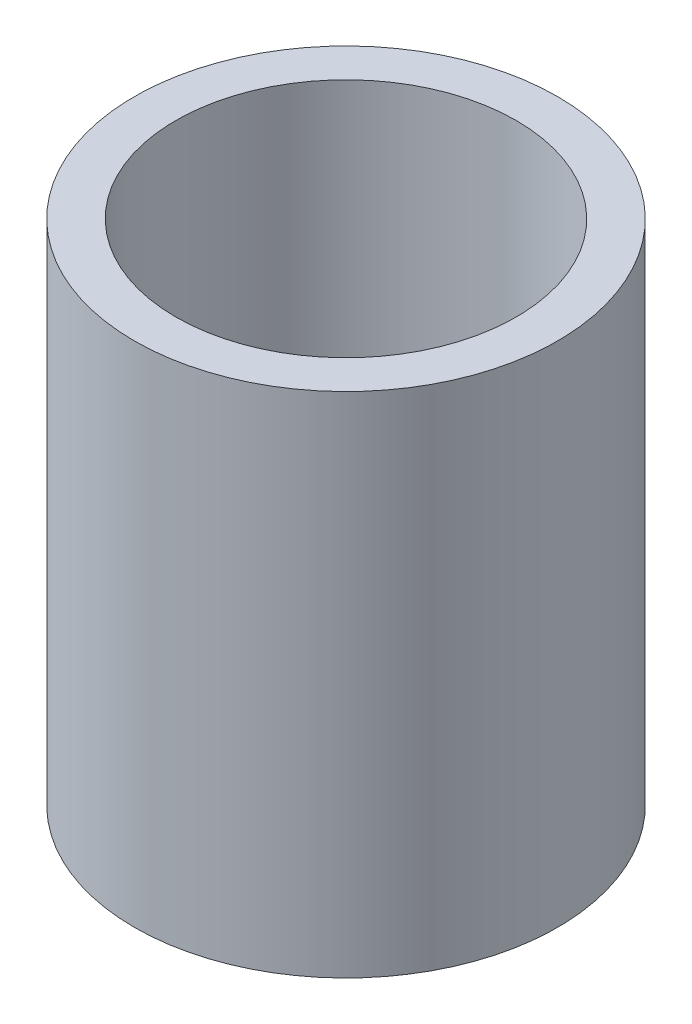
ISO-10303-21;
HEADER;
FILE_DESCRIPTION(('STEP AP214'),'2;1');
FILE_NAME('part.step','',(''),(''),'','','');
FILE_SCHEMA(('AUTOMOTIVE_DESIGN { 1 0 10303 214 1 1 1 1 }'));
ENDSEC;
DATA;
#1=APPLICATION_CONTEXT('core data for automotive mechanical design processes');
#2=APPLICATION_PROTOCOL_DEFINITION('international standard','automotive_design',2000,#1);
#3=PRODUCT_CONTEXT('',#1,'mechanical');
#4=PRODUCT('Part','Part','',(#3));
#5=PRODUCT_RELATED_PRODUCT_CATEGORY('part','',(#4));
#6=PRODUCT_DEFINITION_FORMATION('','',#4);
#7=PRODUCT_DEFINITION_CONTEXT('part definition',#1,'design');
#8=PRODUCT_DEFINITION('design','',#6,#7);
#9=PRODUCT_DEFINITION_SHAPE('','',#8);
#10=(LENGTH_UNIT() NAMED_UNIT(*) SI_UNIT(.MILLI.,.METRE.));
#11=(NAMED_UNIT(*) PLANE_ANGLE_UNIT() SI_UNIT($,.RADIAN.));
#12=(NAMED_UNIT(*) SI_UNIT($,.STERADIAN.) SOLID_ANGLE_UNIT());
#13=UNCERTAINTY_MEASURE_WITH_UNIT(LENGTH_MEASURE(1.E-05),#10,'distance_accuracy_value','');
#14=(GEOMETRIC_REPRESENTATION_CONTEXT(3) GLOBAL_UNCERTAINTY_ASSIGNED_CONTEXT((#13)) GLOBAL_UNIT_ASSIGNED_CONTEXT((#10,
#11,#12)) REPRESENTATION_CONTEXT('',''));
#15=CARTESIAN_POINT('',(0.,0.,0.));
#16=DIRECTION('',(0.,0.,1.));
#17=DIRECTION('',(1.,0.,0.));
#18=AXIS2_PLACEMENT_3D('',#15,#16,#17);
#19=CARTESIAN_POINT('',(0.,38.1,0.));
#20=DIRECTION('',(0.,1.,0.));
#21=DIRECTION('',(0.,0.,1.));
#22=AXIS2_PLACEMENT_3D('',#19,#20,#21);
#23=PLANE('',#22);
#24=CARTESIAN_POINT('',(0.,38.1,0.));
#25=DIRECTION('',(0.,1.,0.));
#26=DIRECTION('',(0.,0.,1.));
#27=AXIS2_PLACEMENT_3D('',#24,#25,#26);
#28=CIRCLE('',#27,15.875);
#29=CARTESIAN_POINT('',(0.,38.1,-15.875));
#30=VERTEX_POINT('',#29);
#31=EDGE_CURVE('E10',#30,#30,#28,.T.);
#32=ORIENTED_EDGE('',*,*,#31,.T.);
#33=EDGE_LOOP('',(#32));
#34=FACE_BOUND('',#33,.T.);
#35=CARTESIAN_POINT('',(0.,38.1,0.));
#36=DIRECTION('',(0.,1.,0.));
#37=DIRECTION('',(0.,0.,1.));
#38=AXIS2_PLACEMENT_3D('',#35,#36,#37);
#39=CIRCLE('',#38,12.76985);
#40=CARTESIAN_POINT('',(0.,38.1,-12.76985));
#41=VERTEX_POINT('',#40);
#42=EDGE_CURVE('E41',#41,#41,#39,.T.);
#43=ORIENTED_EDGE('',*,*,#42,.F.);
#44=EDGE_LOOP('',(#43));
#45=FACE_BOUND('',#44,.T.);
#46=ADVANCED_FACE('F30',(#34,#45),#23,.T.);
#47=CARTESIAN_POINT('',(0.,0.,0.));
#48=DIRECTION('',(0.,1.,0.));
#49=DIRECTION('',(0.,0.,1.));
#50=AXIS2_PLACEMENT_3D('',#47,#48,#49);
#51=PLANE('',#50);
#52=CARTESIAN_POINT('',(0.,0.,0.));
#53=DIRECTION('',(0.,1.,0.));
#54=DIRECTION('',(0.,0.,1.));
#55=AXIS2_PLACEMENT_3D('',#52,#53,#54);
#56=CIRCLE('',#55,15.875);
#57=CARTESIAN_POINT('',(0.,0.,-15.875));
#58=VERTEX_POINT('',#57);
#59=EDGE_CURVE('E34',#58,#58,#56,.T.);
#60=ORIENTED_EDGE('',*,*,#59,.F.);
#61=EDGE_LOOP('',(#60));
#62=FACE_BOUND('',#61,.T.);
#63=CARTESIAN_POINT('',(0.,0.,0.));
#64=DIRECTION('',(0.,1.,0.));
#65=DIRECTION('',(0.,0.,1.));
#66=AXIS2_PLACEMENT_3D('',#63,#64,#65);
#67=CIRCLE('',#66,12.76985);
#68=CARTESIAN_POINT('',(0.,0.,-12.76985));
#69=VERTEX_POINT('',#68);
#70=EDGE_CURVE('E43',#69,#69,#67,.T.);
#71=ORIENTED_EDGE('',*,*,#70,.T.);
#72=EDGE_LOOP('',(#71));
#73=FACE_BOUND('',#72,.T.);
#74=ADVANCED_FACE('F53',(#62,#73),#51,.F.);
#75=CARTESIAN_POINT('',(0.,38.1,0.));
#76=DIRECTION('',(0.,-1.,0.));
#77=DIRECTION('',(0.,0.,-1.));
#78=AXIS2_PLACEMENT_3D('',#75,#76,#77);
#79=CYLINDRICAL_SURFACE('',#78,15.875);
#80=CARTESIAN_POINT('',(0.,38.1,-15.875));
#81=CARTESIAN_POINT('',(0.,37.703125,-15.875));
#82=CARTESIAN_POINT('',(0.,37.30625,-15.875));
#83=CARTESIAN_POINT('',(0.,36.5125,-15.875));
#84=CARTESIAN_POINT('',(0.,36.115625,-15.875));
#85=CARTESIAN_POINT('',(0.,35.321875,-15.875));
#86=CARTESIAN_POINT('',(0.,34.925,-15.875));
#87=CARTESIAN_POINT('',(0.,34.13125,-15.875));
#88=CARTESIAN_POINT('',(0.,33.734375,-15.875));
#89=CARTESIAN_POINT('',(0.,32.940625,-15.875));
#90=CARTESIAN_POINT('',(0.,32.54375,-15.875));
#91=CARTESIAN_POINT('',(0.,31.75,-15.875));
#92=CARTESIAN_POINT('',(0.,31.353125,-15.875));
#93=CARTESIAN_POINT('',(0.,30.559375,-15.875));
#94=CARTESIAN_POINT('',(0.,30.1625,-15.875));
#95=CARTESIAN_POINT('',(0.,29.36875,-15.875));
#96=CARTESIAN_POINT('',(0.,28.971875,-15.875));
#97=CARTESIAN_POINT('',(0.,28.178125,-15.875));
#98=CARTESIAN_POINT('',(0.,27.78125,-15.875));
#99=CARTESIAN_POINT('',(0.,26.9875,-15.875));
#100=CARTESIAN_POINT('',(0.,26.590625,-15.875));
#101=CARTESIAN_POINT('',(0.,25.796875,-15.875));
#102=CARTESIAN_POINT('',(0.,25.4,-15.875));
#103=CARTESIAN_POINT('',(0.,24.60625,-15.875));
#104=CARTESIAN_POINT('',(0.,24.209375,-15.875));
#105=CARTESIAN_POINT('',(0.,23.415625,-15.875));
#106=CARTESIAN_POINT('',(0.,23.01875,-15.875));
#107=CARTESIAN_POINT('',(0.,22.225,-15.875));
#108=CARTESIAN_POINT('',(0.,21.828125,-15.875));
#109=CARTESIAN_POINT('',(0.,21.034375,-15.875));
#110=CARTESIAN_POINT('',(0.,20.6375,-15.875));
#111=CARTESIAN_POINT('',(0.,19.84375,-15.875));
#112=CARTESIAN_POINT('',(0.,19.446875,-15.875));
#113=CARTESIAN_POINT('',(0.,18.653125,-15.875));
#114=CARTESIAN_POINT('',(0.,18.25625,-15.875));
#115=CARTESIAN_POINT('',(0.,17.4625,-15.875));
#116=CARTESIAN_POINT('',(0.,17.065625,-15.875));
#117=CARTESIAN_POINT('',(0.,16.271875,-15.875));
#118=CARTESIAN_POINT('',(0.,15.875,-15.875));
#119=CARTESIAN_POINT('',(0.,15.08125,-15.875));
#120=CARTESIAN_POINT('',(0.,14.684375,-15.875));
#121=CARTESIAN_POINT('',(0.,13.890625,-15.875));
#122=CARTESIAN_POINT('',(0.,13.49375,-15.875));
#123=CARTESIAN_POINT('',(0.,12.7,-15.875));
#124=CARTESIAN_POINT('',(0.,12.303125,-15.875));
#125=CARTESIAN_POINT('',(0.,11.509375,-15.875));
#126=CARTESIAN_POINT('',(0.,11.1125,-15.875));
#127=CARTESIAN_POINT('',(0.,10.31875,-15.875));
#128=CARTESIAN_POINT('',(0.,9.921875,-15.875));
#129=CARTESIAN_POINT('',(0.,9.128125,-15.875));
#130=CARTESIAN_POINT('',(0.,8.73125,-15.875));
#131=CARTESIAN_POINT('',(0.,7.9375,-15.875));
#132=CARTESIAN_POINT('',(0.,7.540625,-15.875));
#133=CARTESIAN_POINT('',(0.,6.746875,-15.875));
#134=CARTESIAN_POINT('',(0.,6.35,-15.875));
#135=CARTESIAN_POINT('',(0.,5.55625,-15.875));
#136=CARTESIAN_POINT('',(0.,5.159375,-15.875));
#137=CARTESIAN_POINT('',(0.,4.365625,-15.875));
#138=CARTESIAN_POINT('',(0.,3.96875,-15.875));
#139=CARTESIAN_POINT('',(0.,3.175,-15.875));
#140=CARTESIAN_POINT('',(0.,2.778125,-15.875));
#141=CARTESIAN_POINT('',(0.,1.984375,-15.875));
#142=CARTESIAN_POINT('',(0.,1.5875,-15.875));
#143=CARTESIAN_POINT('',(0.,0.79375,-15.875));
#144=CARTESIAN_POINT('',(0.,0.396875,-15.875));
#145=CARTESIAN_POINT('',(0.,0.,-15.875));
#146=B_SPLINE_CURVE_WITH_KNOTS('',3,(#80,#81,#82,#83,#84,#85,#86,#87,#88,#89,#90,#91,#92,#93,
#94,#95,#96,#97,#98,#99,#100,#101,#102,#103,#104,#105,#106,#107,#108,#109,#110,#111,#112,#113,
#114,#115,#116,#117,#118,#119,#120,#121,#122,#123,#124,#125,#126,#127,#128,#129,#130,#131,#132,
#133,#134,#135,#136,#137,#138,#139,#140,#141,#142,#143,#144,#145),.UNSPECIFIED.,.F.,.F.,(4,2,2,
2,2,2,2,2,2,2,2,2,2,2,2,2,2,2,2,2,2,2,2,2,2,2,2,2,2,2,2,2,4),(0.,1.19062499999999,
2.38124999999999,3.571875,4.7625,5.953125,7.14375,8.33437499999999,9.525,10.715625,11.90625,
13.096875,14.2875,15.478125,16.66875,17.859375,19.05,20.240625,21.43125,22.621875,23.8125,
25.003125,26.19375,27.384375,28.575,29.765625,30.95625,32.146875,33.3375,34.528125,35.71875,
36.909375,38.1),.UNSPECIFIED.);
#147=EDGE_CURVE('BSEAM32',#30,#58,#146,.T.);
#148=ORIENTED_EDGE('',*,*,#31,.F.);
#149=ORIENTED_EDGE('',*,*,#59,.T.);
#150=ORIENTED_EDGE('',*,*,#147,.T.);
#151=ORIENTED_EDGE('',*,*,#147,.F.);
#152=EDGE_LOOP('',(#148,#150,#149,#151));
#153=FACE_BOUND('',#152,.T.);
#154=ADVANCED_FACE('F32',(#153),#79,.T.);
#155=CARTESIAN_POINT('',(0.,38.1,0.));
#156=DIRECTION('',(0.,-1.,0.));
#157=DIRECTION('',(0.,0.,-1.));
#158=AXIS2_PLACEMENT_3D('',#155,#156,#157);
#159=CYLINDRICAL_SURFACE('',#158,12.76985);
#160=CARTESIAN_POINT('',(0.,38.1,-12.76985));
#161=CARTESIAN_POINT('',(0.,37.703125,-12.76985));
#162=CARTESIAN_POINT('',(0.,37.30625,-12.76985));
#163=CARTESIAN_POINT('',(0.,36.5125,-12.76985));
#164=CARTESIAN_POINT('',(0.,36.115625,-12.76985));
#165=CARTESIAN_POINT('',(0.,35.321875,-12.76985));
#166=CARTESIAN_POINT('',(0.,34.925,-12.76985));
#167=CARTESIAN_POINT('',(0.,34.13125,-12.76985));
#168=CARTESIAN_POINT('',(0.,33.734375,-12.76985));
#169=CARTESIAN_POINT('',(0.,32.940625,-12.76985));
#170=CARTESIAN_POINT('',(0.,32.54375,-12.76985));
#171=CARTESIAN_POINT('',(0.,31.75,-12.76985));
#172=CARTESIAN_POINT('',(0.,31.353125,-12.76985));
#173=CARTESIAN_POINT('',(0.,30.559375,-12.76985));
#174=CARTESIAN_POINT('',(0.,30.1625,-12.76985));
#175=CARTESIAN_POINT('',(0.,29.36875,-12.76985));
#176=CARTESIAN_POINT('',(0.,28.971875,-12.76985));
#177=CARTESIAN_POINT('',(0.,28.178125,-12.76985));
#178=CARTESIAN_POINT('',(0.,27.78125,-12.76985));
#179=CARTESIAN_POINT('',(0.,26.9875,-12.76985));
#180=CARTESIAN_POINT('',(0.,26.590625,-12.76985));
#181=CARTESIAN_POINT('',(0.,25.796875,-12.76985));
#182=CARTESIAN_POINT('',(0.,25.4,-12.76985));
#183=CARTESIAN_POINT('',(0.,24.60625,-12.76985));
#184=CARTESIAN_POINT('',(0.,24.209375,-12.76985));
#185=CARTESIAN_POINT('',(0.,23.415625,-12.76985));
#186=CARTESIAN_POINT('',(0.,23.01875,-12.76985));
#187=CARTESIAN_POINT('',(0.,22.225,-12.76985));
#188=CARTESIAN_POINT('',(0.,21.828125,-12.76985));
#189=CARTESIAN_POINT('',(0.,21.034375,-12.76985));
#190=CARTESIAN_POINT('',(0.,20.6375,-12.76985));
#191=CARTESIAN_POINT('',(0.,19.84375,-12.76985));
#192=CARTESIAN_POINT('',(0.,19.446875,-12.76985));
#193=CARTESIAN_POINT('',(0.,18.653125,-12.76985));
#194=CARTESIAN_POINT('',(0.,18.25625,-12.76985));
#195=CARTESIAN_POINT('',(0.,17.4625,-12.76985));
#196=CARTESIAN_POINT('',(0.,17.065625,-12.76985));
#197=CARTESIAN_POINT('',(0.,16.271875,-12.76985));
#198=CARTESIAN_POINT('',(0.,15.875,-12.76985));
#199=CARTESIAN_POINT('',(0.,15.08125,-12.76985));
#200=CARTESIAN_POINT('',(0.,14.684375,-12.76985));
#201=CARTESIAN_POINT('',(0.,13.890625,-12.76985));
#202=CARTESIAN_POINT('',(0.,13.49375,-12.76985));
#203=CARTESIAN_POINT('',(0.,12.7,-12.76985));
#204=CARTESIAN_POINT('',(0.,12.303125,-12.76985));
#205=CARTESIAN_POINT('',(0.,11.509375,-12.76985));
#206=CARTESIAN_POINT('',(0.,11.1125,-12.76985));
#207=CARTESIAN_POINT('',(0.,10.31875,-12.76985));
#208=CARTESIAN_POINT('',(0.,9.921875,-12.76985));
#209=CARTESIAN_POINT('',(0.,9.128125,-12.76985));
#210=CARTESIAN_POINT('',(0.,8.73125,-12.76985));
#211=CARTESIAN_POINT('',(0.,7.9375,-12.76985));
#212=CARTESIAN_POINT('',(0.,7.540625,-12.76985));
#213=CARTESIAN_POINT('',(0.,6.746875,-12.76985));
#214=CARTESIAN_POINT('',(0.,6.35,-12.76985));
#215=CARTESIAN_POINT('',(0.,5.55625,-12.76985));
#216=CARTESIAN_POINT('',(0.,5.159375,-12.76985));
#217=CARTESIAN_POINT('',(0.,4.365625,-12.76985));
#218=CARTESIAN_POINT('',(0.,3.96875,-12.76985));
#219=CARTESIAN_POINT('',(0.,3.175,-12.76985));
#220=CARTESIAN_POINT('',(0.,2.778125,-12.76985));
#221=CARTESIAN_POINT('',(0.,1.984375,-12.76985));
#222=CARTESIAN_POINT('',(0.,1.5875,-12.76985));
#223=CARTESIAN_POINT('',(0.,0.79375,-12.76985));
#224=CARTESIAN_POINT('',(0.,0.396875,-12.76985));
#225=CARTESIAN_POINT('',(0.,0.,-12.76985));
#226=B_SPLINE_CURVE_WITH_KNOTS('',3,(#160,#161,#162,#163,#164,#165,#166,#167,#168,#169,#170,
#171,#172,#173,#174,#175,#176,#177,#178,#179,#180,#181,#182,#183,#184,#185,#186,#187,#188,#189,
#190,#191,#192,#193,#194,#195,#196,#197,#198,#199,#200,#201,#202,#203,#204,#205,#206,#207,#208,
#209,#210,#211,#212,#213,#214,#215,#216,#217,#218,#219,#220,#221,#222,#223,#224,#225),
.UNSPECIFIED.,.F.,.F.,(4,2,2,2,2,2,2,2,2,2,2,2,2,2,2,2,2,2,2,2,2,2,2,2,2,2,2,2,2,2,2,2,4),(0.,
1.19062499999999,2.38124999999999,3.571875,4.7625,5.953125,7.14375,8.33437499999999,9.525,
10.715625,11.90625,13.096875,14.2875,15.478125,16.66875,17.859375,19.05,20.240625,21.43125,
22.621875,23.8125,25.003125,26.19375,27.384375,28.575,29.765625,30.95625,32.146875,33.3375,
34.528125,35.71875,36.909375,38.1),.UNSPECIFIED.);
#227=EDGE_CURVE('BSEAM49',#41,#69,#226,.T.);
#228=ORIENTED_EDGE('',*,*,#42,.T.);
#229=ORIENTED_EDGE('',*,*,#70,.F.);
#230=ORIENTED_EDGE('',*,*,#227,.T.);
#231=ORIENTED_EDGE('',*,*,#227,.F.);
#232=EDGE_LOOP('',(#228,#230,#229,#231));
#233=FACE_BOUND('',#232,.T.);
#234=ADVANCED_FACE('F49',(#233),#159,.F.);
#235=CLOSED_SHELL('',(#46,#74,#154,#234));
#236=MANIFOLD_SOLID_BREP('B2',#235);
#237=ADVANCED_BREP_SHAPE_REPRESENTATION('',(#18,#236),#14);
#238=SHAPE_DEFINITION_REPRESENTATION(#9,#237);
ENDSEC;
END-ISO-10303-21;
